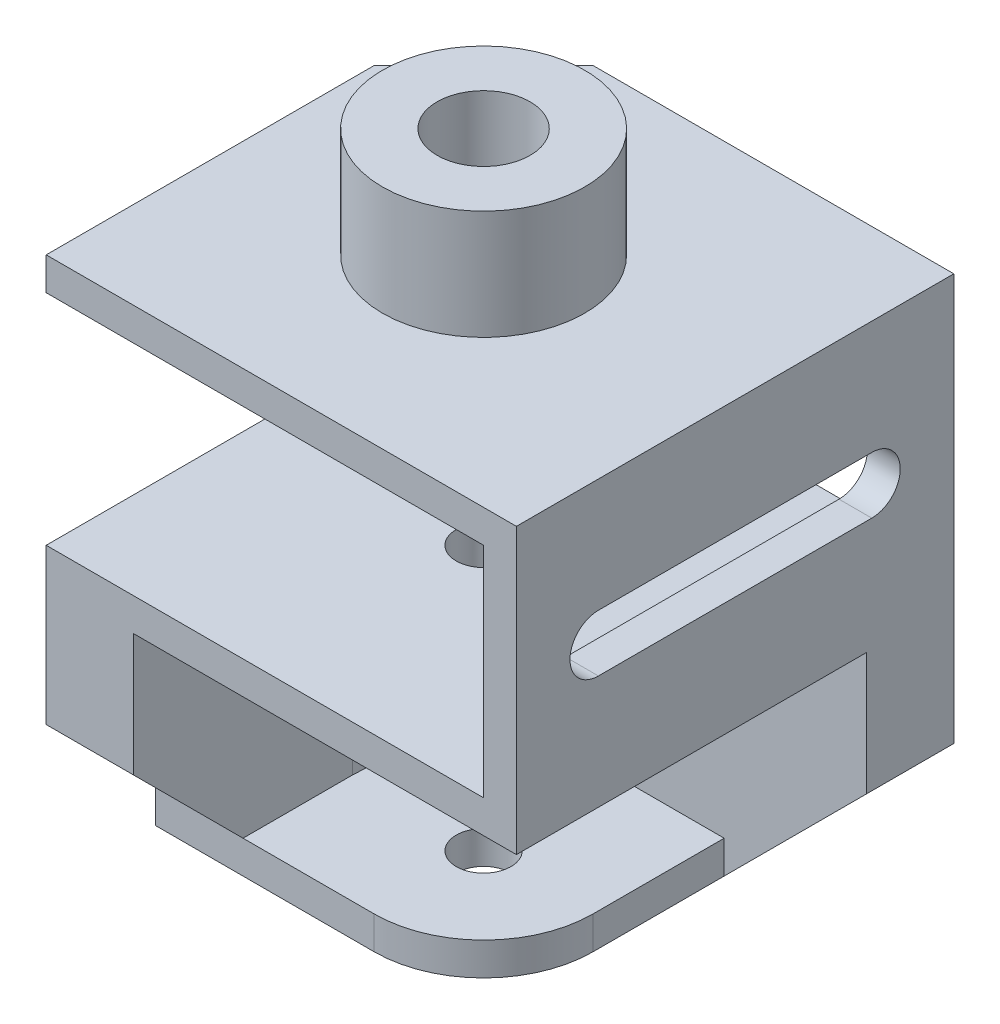
ISO-10303-21;
HEADER;
FILE_DESCRIPTION(('STEP AP214'),'2;1');
FILE_NAME('part.step','',(''),(''),'','','');
FILE_SCHEMA(('AUTOMOTIVE_DESIGN { 1 0 10303 214 1 1 1 1 }'));
ENDSEC;
DATA;
#1=APPLICATION_CONTEXT('core data for automotive mechanical design processes');
#2=APPLICATION_PROTOCOL_DEFINITION('international standard','automotive_design',2000,#1);
#3=PRODUCT_CONTEXT('',#1,'mechanical');
#4=PRODUCT('Part','Part','',(#3));
#5=PRODUCT_RELATED_PRODUCT_CATEGORY('part','',(#4));
#6=PRODUCT_DEFINITION_FORMATION('','',#4);
#7=PRODUCT_DEFINITION_CONTEXT('part definition',#1,'design');
#8=PRODUCT_DEFINITION('design','',#6,#7);
#9=PRODUCT_DEFINITION_SHAPE('','',#8);
#10=(LENGTH_UNIT() NAMED_UNIT(*) SI_UNIT(.MILLI.,.METRE.));
#11=(NAMED_UNIT(*) PLANE_ANGLE_UNIT() SI_UNIT($,.RADIAN.));
#12=(NAMED_UNIT(*) SI_UNIT($,.STERADIAN.) SOLID_ANGLE_UNIT());
#13=UNCERTAINTY_MEASURE_WITH_UNIT(LENGTH_MEASURE(1.E-05),#10,'distance_accuracy_value','');
#14=(GEOMETRIC_REPRESENTATION_CONTEXT(3) GLOBAL_UNCERTAINTY_ASSIGNED_CONTEXT((#13)) GLOBAL_UNIT_ASSIGNED_CONTEXT((#10,
#11,#12)) REPRESENTATION_CONTEXT('',''));
#15=CARTESIAN_POINT('',(0.,0.,0.));
#16=DIRECTION('',(0.,0.,1.));
#17=DIRECTION('',(1.,0.,0.));
#18=AXIS2_PLACEMENT_3D('',#15,#16,#17);
#19=CARTESIAN_POINT('',(9.99999999999994,-47.2,0.));
#20=DIRECTION('',(-1.,0.,0.));
#21=DIRECTION('',(0.,0.,1.));
#22=AXIS2_PLACEMENT_3D('',#19,#20,#21);
#23=PLANE('',#22);
#24=DIRECTION('',(0.,1.,0.));
#25=VECTOR('',#24,1.);
#26=CARTESIAN_POINT('',(9.99999999999994,-44.2,-12.));
#27=LINE('',#26,#25);
#28=CARTESIAN_POINT('',(9.99999999999994,-47.2,-12.));
#29=VERTEX_POINT('',#28);
#30=CARTESIAN_POINT('',(9.99999999999994,-44.2,-12.));
#31=VERTEX_POINT('',#30);
#32=EDGE_CURVE('E206',#29,#31,#27,.T.);
#33=ORIENTED_EDGE('',*,*,#32,.T.);
#34=DIRECTION('',(0.,0.,1.));
#35=VECTOR('',#34,1.);
#36=CARTESIAN_POINT('',(9.99999999999994,-44.2,0.));
#37=LINE('',#36,#35);
#38=CARTESIAN_POINT('',(9.99999999999994,-44.2,0.));
#39=VERTEX_POINT('',#38);
#40=EDGE_CURVE('E520',#31,#39,#37,.T.);
#41=ORIENTED_EDGE('',*,*,#40,.T.);
#42=DIRECTION('',(0.,1.,0.));
#43=VECTOR('',#42,1.);
#44=CARTESIAN_POINT('',(9.99999999999994,-47.2,0.));
#45=LINE('',#44,#43);
#46=CARTESIAN_POINT('',(9.99999999999994,-47.2,0.));
#47=VERTEX_POINT('',#46);
#48=EDGE_CURVE('E527',#47,#39,#45,.T.);
#49=ORIENTED_EDGE('',*,*,#48,.F.);
#50=DIRECTION('',(0.,0.,1.));
#51=VECTOR('',#50,1.);
#52=CARTESIAN_POINT('',(9.99999999999994,-47.2,0.));
#53=LINE('',#52,#51);
#54=EDGE_CURVE('E564',#29,#47,#53,.T.);
#55=ORIENTED_EDGE('',*,*,#54,.F.);
#56=EDGE_LOOP('',(#33,#41,#49,#55));
#57=FACE_BOUND('',#56,.T.);
#58=ADVANCED_FACE('F33',(#57),#23,.F.);
#59=CARTESIAN_POINT('',(0.,-23.,0.));
#60=DIRECTION('',(0.,1.,0.));
#61=DIRECTION('',(0.,0.,1.));
#62=AXIS2_PLACEMENT_3D('',#59,#60,#61);
#63=PLANE('',#62);
#64=CARTESIAN_POINT('',(0.,-23.,0.));
#65=DIRECTION('',(0.,1.,0.));
#66=DIRECTION('',(0.,0.,1.));
#67=AXIS2_PLACEMENT_3D('',#64,#65,#66);
#68=CIRCLE('',#67,6.);
#69=CARTESIAN_POINT('',(0.,-23.,5.99999999999999));
#70=VERTEX_POINT('',#69);
#71=EDGE_CURVE('E232',#70,#70,#68,.F.);
#72=ORIENTED_EDGE('',*,*,#71,.F.);
#73=EDGE_LOOP('',(#72));
#74=FACE_BOUND('',#73,.T.);
#75=DIRECTION('',(0.,0.,1.));
#76=VECTOR('',#75,1.);
#77=CARTESIAN_POINT('',(-12.,-23.,0.));
#78=LINE('',#77,#76);
#79=CARTESIAN_POINT('',(-12.,-23.,0.));
#80=VERTEX_POINT('',#79);
#81=CARTESIAN_POINT('',(-12.,-23.,20.));
#82=VERTEX_POINT('',#81);
#83=EDGE_CURVE('E278',#80,#82,#78,.T.);
#84=ORIENTED_EDGE('',*,*,#83,.F.);
#85=CARTESIAN_POINT('',(0.,-23.,0.));
#86=DIRECTION('',(0.,1.,0.));
#87=DIRECTION('',(0.,0.,1.));
#88=AXIS2_PLACEMENT_3D('',#85,#86,#87);
#89=CIRCLE('',#88,12.);
#90=CARTESIAN_POINT('',(0.,-23.,-12.));
#91=VERTEX_POINT('',#90);
#92=EDGE_CURVE('E539',#91,#80,#89,.T.);
#93=ORIENTED_EDGE('',*,*,#92,.F.);
#94=DIRECTION('',(-1.,0.,0.));
#95=VECTOR('',#94,1.);
#96=CARTESIAN_POINT('',(23.,-23.,-12.));
#97=LINE('',#96,#95);
#98=CARTESIAN_POINT('',(23.,-23.,-12.));
#99=VERTEX_POINT('',#98);
#100=EDGE_CURVE('E530',#99,#91,#97,.T.);
#101=ORIENTED_EDGE('',*,*,#100,.F.);
#102=DIRECTION('',(0.,0.,1.));
#103=VECTOR('',#102,1.);
#104=CARTESIAN_POINT('',(23.,-23.,20.));
#105=LINE('',#104,#103);
#106=CARTESIAN_POINT('',(23.,-23.,20.));
#107=VERTEX_POINT('',#106);
#108=EDGE_CURVE('E304',#99,#107,#105,.T.);
#109=ORIENTED_EDGE('',*,*,#108,.T.);
#110=DIRECTION('',(-1.,0.,0.));
#111=VECTOR('',#110,1.);
#112=CARTESIAN_POINT('',(23.,-23.,20.));
#113=LINE('',#112,#111);
#114=EDGE_CURVE('E268',#107,#82,#113,.T.);
#115=ORIENTED_EDGE('',*,*,#114,.T.);
#116=EDGE_LOOP('',(#84,#93,#101,#109,#115));
#117=FACE_BOUND('',#116,.T.);
#118=ADVANCED_FACE('F368',(#74,#117),#63,.F.);
#119=CARTESIAN_POINT('',(0.,3.,0.));
#120=DIRECTION('',(0.,1.,0.));
#121=DIRECTION('',(0.,0.,1.));
#122=AXIS2_PLACEMENT_3D('',#119,#120,#121);
#123=PLANE('',#122);
#124=DIRECTION('',(0.707106781186548,0.,-0.707106781186547));
#125=VECTOR('',#124,1.);
#126=CARTESIAN_POINT('',(-15.,3.,-15.));
#127=LINE('',#126,#125);
#128=CARTESIAN_POINT('',(-20.,3.,-10.));
#129=VERTEX_POINT('',#128);
#130=CARTESIAN_POINT('',(-9.99999999999999,3.,-20.));
#131=VERTEX_POINT('',#130);
#132=EDGE_CURVE('E187',#129,#131,#127,.T.);
#133=ORIENTED_EDGE('',*,*,#132,.F.);
#134=DIRECTION('',(0.,0.,1.));
#135=VECTOR('',#134,1.);
#136=CARTESIAN_POINT('',(-20.,3.,-20.));
#137=LINE('',#136,#135);
#138=CARTESIAN_POINT('',(-20.,3.,20.));
#139=VERTEX_POINT('',#138);
#140=EDGE_CURVE('E212',#129,#139,#137,.T.);
#141=ORIENTED_EDGE('',*,*,#140,.T.);
#142=DIRECTION('',(1.,0.,0.));
#143=VECTOR('',#142,1.);
#144=CARTESIAN_POINT('',(-20.,3.,20.));
#145=LINE('',#144,#143);
#146=CARTESIAN_POINT('',(23.,3.,20.));
#147=VERTEX_POINT('',#146);
#148=EDGE_CURVE('E215',#139,#147,#145,.T.);
#149=ORIENTED_EDGE('',*,*,#148,.T.);
#150=DIRECTION('',(0.,0.,1.));
#151=VECTOR('',#150,1.);
#152=CARTESIAN_POINT('',(23.,3.,20.));
#153=LINE('',#152,#151);
#154=CARTESIAN_POINT('',(23.,3.,-20.));
#155=VERTEX_POINT('',#154);
#156=EDGE_CURVE('E211',#155,#147,#153,.T.);
#157=ORIENTED_EDGE('',*,*,#156,.F.);
#158=DIRECTION('',(-1.,0.,0.));
#159=VECTOR('',#158,1.);
#160=CARTESIAN_POINT('',(-20.,3.,-20.));
#161=LINE('',#160,#159);
#162=EDGE_CURVE('E202',#155,#131,#161,.T.);
#163=ORIENTED_EDGE('',*,*,#162,.T.);
#164=EDGE_LOOP('',(#133,#141,#149,#157,#163));
#165=FACE_BOUND('',#164,.T.);
#166=CARTESIAN_POINT('',(0.,3.,0.));
#167=DIRECTION('',(0.,1.,0.));
#168=DIRECTION('',(0.,0.,1.));
#169=AXIS2_PLACEMENT_3D('',#166,#167,#168);
#170=CIRCLE('',#169,9.25);
#171=CARTESIAN_POINT('',(0.,3.,9.24999999999999));
#172=VERTEX_POINT('',#171);
#173=EDGE_CURVE('E359',#172,#172,#170,.T.);
#174=ORIENTED_EDGE('',*,*,#173,.F.);
#175=EDGE_LOOP('',(#174));
#176=FACE_BOUND('',#175,.T.);
#177=ADVANCED_FACE('F208',(#165,#176),#123,.T.);
#178=CARTESIAN_POINT('',(0.,0.,0.));
#179=DIRECTION('',(0.,1.,0.));
#180=DIRECTION('',(0.,0.,1.));
#181=AXIS2_PLACEMENT_3D('',#178,#179,#180);
#182=PLANE('',#181);
#183=DIRECTION('',(0.,0.,1.));
#184=VECTOR('',#183,1.);
#185=CARTESIAN_POINT('',(-20.,0.,-20.));
#186=LINE('',#185,#184);
#187=CARTESIAN_POINT('',(-20.,0.,-10.));
#188=VERTEX_POINT('',#187);
#189=CARTESIAN_POINT('',(-20.,0.,20.));
#190=VERTEX_POINT('',#189);
#191=EDGE_CURVE('E217',#188,#190,#186,.T.);
#192=ORIENTED_EDGE('',*,*,#191,.F.);
#193=DIRECTION('',(0.707106781186548,0.,-0.707106781186547));
#194=VECTOR('',#193,1.);
#195=CARTESIAN_POINT('',(-15.,0.,-15.));
#196=LINE('',#195,#194);
#197=CARTESIAN_POINT('',(-9.99999999999999,0.,-20.));
#198=VERTEX_POINT('',#197);
#199=EDGE_CURVE('E56',#188,#198,#196,.T.);
#200=ORIENTED_EDGE('',*,*,#199,.T.);
#201=DIRECTION('',(-1.,0.,0.));
#202=VECTOR('',#201,1.);
#203=CARTESIAN_POINT('',(-20.,0.,-20.));
#204=LINE('',#203,#202);
#205=CARTESIAN_POINT('',(20.,0.,-20.));
#206=VERTEX_POINT('',#205);
#207=EDGE_CURVE('E205',#206,#198,#204,.T.);
#208=ORIENTED_EDGE('',*,*,#207,.F.);
#209=DIRECTION('',(0.,0.,-1.));
#210=VECTOR('',#209,1.);
#211=CARTESIAN_POINT('',(20.,0.,-20.));
#212=LINE('',#211,#210);
#213=CARTESIAN_POINT('',(20.,0.,20.));
#214=VERTEX_POINT('',#213);
#215=EDGE_CURVE('E225',#214,#206,#212,.T.);
#216=ORIENTED_EDGE('',*,*,#215,.F.);
#217=DIRECTION('',(1.,0.,0.));
#218=VECTOR('',#217,1.);
#219=CARTESIAN_POINT('',(-20.,0.,20.));
#220=LINE('',#219,#218);
#221=EDGE_CURVE('E213',#190,#214,#220,.T.);
#222=ORIENTED_EDGE('',*,*,#221,.F.);
#223=EDGE_LOOP('',(#192,#200,#208,#216,#222));
#224=FACE_BOUND('',#223,.T.);
#225=CARTESIAN_POINT('',(0.,0.,0.));
#226=DIRECTION('',(0.,1.,0.));
#227=DIRECTION('',(0.,0.,1.));
#228=AXIS2_PLACEMENT_3D('',#225,#226,#227);
#229=CIRCLE('',#228,4.25);
#230=CARTESIAN_POINT('',(0.,0.,4.24999999999999));
#231=VERTEX_POINT('',#230);
#232=EDGE_CURVE('E220',#231,#231,#229,.T.);
#233=ORIENTED_EDGE('',*,*,#232,.T.);
#234=EDGE_LOOP('',(#233));
#235=FACE_BOUND('',#234,.T.);
#236=ADVANCED_FACE('F367',(#224,#235),#182,.F.);
#237=CARTESIAN_POINT('',(-20.,3.,-20.));
#238=DIRECTION('',(0.,0.,1.));
#239=DIRECTION('',(1.,0.,0.));
#240=AXIS2_PLACEMENT_3D('',#237,#238,#239);
#241=PLANE('',#240);
#242=DIRECTION('',(0.,1.,0.));
#243=VECTOR('',#242,1.);
#244=CARTESIAN_POINT('',(-10.,-102.928187440104,-20.));
#245=LINE('',#244,#243);
#246=CARTESIAN_POINT('',(-10.,-47.2,-20.));
#247=VERTEX_POINT('',#246);
#248=CARTESIAN_POINT('',(-9.99999999999999,-20.,-20.));
#249=VERTEX_POINT('',#248);
#250=EDGE_CURVE('E286',#247,#249,#245,.T.);
#251=ORIENTED_EDGE('',*,*,#250,.T.);
#252=DIRECTION('',(1.,0.,0.));
#253=VECTOR('',#252,1.);
#254=CARTESIAN_POINT('',(23.,-20.,-20.));
#255=LINE('',#254,#253);
#256=CARTESIAN_POINT('',(20.,-20.,-20.));
#257=VERTEX_POINT('',#256);
#258=EDGE_CURVE('E306',#249,#257,#255,.T.);
#259=ORIENTED_EDGE('',*,*,#258,.T.);
#260=DIRECTION('',(0.,1.,0.));
#261=VECTOR('',#260,1.);
#262=CARTESIAN_POINT('',(20.,3.,-20.));
#263=LINE('',#262,#261);
#264=EDGE_CURVE('E348',#257,#206,#263,.T.);
#265=ORIENTED_EDGE('',*,*,#264,.T.);
#266=ORIENTED_EDGE('',*,*,#207,.T.);
#267=DIRECTION('',(0.,-1.,0.));
#268=VECTOR('',#267,1.);
#269=CARTESIAN_POINT('',(-9.99999999999999,8.,-20.));
#270=LINE('',#269,#268);
#271=EDGE_CURVE('E190',#131,#198,#270,.T.);
#272=ORIENTED_EDGE('',*,*,#271,.F.);
#273=ORIENTED_EDGE('',*,*,#162,.F.);
#274=DIRECTION('',(0.,1.,0.));
#275=VECTOR('',#274,1.);
#276=CARTESIAN_POINT('',(23.,3.,-20.));
#277=LINE('',#276,#275);
#278=CARTESIAN_POINT('',(23.,-34.2,-20.));
#279=VERTEX_POINT('',#278);
#280=EDGE_CURVE('E347',#279,#155,#277,.T.);
#281=ORIENTED_EDGE('',*,*,#280,.F.);
#282=DIRECTION('',(-0.707106781186549,-0.707106781186546,0.));
#283=VECTOR('',#282,1.);
#284=CARTESIAN_POINT('',(23.,-34.2,-20.));
#285=LINE('',#284,#283);
#286=CARTESIAN_POINT('',(9.99999999999994,-47.2,-20.));
#287=VERTEX_POINT('',#286);
#288=EDGE_CURVE('E238',#279,#287,#285,.T.);
#289=ORIENTED_EDGE('',*,*,#288,.T.);
#290=DIRECTION('',(1.,0.,0.));
#291=VECTOR('',#290,1.);
#292=CARTESIAN_POINT('',(-10.,-47.2,-20.));
#293=LINE('',#292,#291);
#294=EDGE_CURVE('E518',#247,#287,#293,.T.);
#295=ORIENTED_EDGE('',*,*,#294,.F.);
#296=EDGE_LOOP('',(#251,#259,#265,#266,#272,#273,#281,#289,#295));
#297=FACE_BOUND('',#296,.T.);
#298=ADVANCED_FACE('F200',(#297),#241,.F.);
#299=CARTESIAN_POINT('',(-20.,3.,-20.));
#300=DIRECTION('',(1.,0.,0.));
#301=DIRECTION('',(0.,0.,-1.));
#302=AXIS2_PLACEMENT_3D('',#299,#300,#301);
#303=PLANE('',#302);
#304=ORIENTED_EDGE('',*,*,#140,.F.);
#305=DIRECTION('',(0.,-1.,0.));
#306=VECTOR('',#305,1.);
#307=CARTESIAN_POINT('',(-20.,8.,-10.));
#308=LINE('',#307,#306);
#309=EDGE_CURVE('E191',#129,#188,#308,.T.);
#310=ORIENTED_EDGE('',*,*,#309,.T.);
#311=ORIENTED_EDGE('',*,*,#191,.T.);
#312=DIRECTION('',(0.,-1.,0.));
#313=VECTOR('',#312,1.);
#314=CARTESIAN_POINT('',(-20.,3.,20.));
#315=LINE('',#314,#313);
#316=EDGE_CURVE('E224',#139,#190,#315,.T.);
#317=ORIENTED_EDGE('',*,*,#316,.F.);
#318=EDGE_LOOP('',(#304,#310,#311,#317));
#319=FACE_BOUND('',#318,.T.);
#320=ADVANCED_FACE('F461',(#319),#303,.F.);
#321=CARTESIAN_POINT('',(-20.,3.,20.));
#322=DIRECTION('',(0.,0.,-1.));
#323=DIRECTION('',(-1.,0.,0.));
#324=AXIS2_PLACEMENT_3D('',#321,#322,#323);
#325=PLANE('',#324);
#326=DIRECTION('',(0.,1.,0.));
#327=VECTOR('',#326,1.);
#328=CARTESIAN_POINT('',(-20.,-23.,20.));
#329=LINE('',#328,#327);
#330=CARTESIAN_POINT('',(-20.,-34.2,20.));
#331=VERTEX_POINT('',#330);
#332=CARTESIAN_POINT('',(-20.,-20.,20.));
#333=VERTEX_POINT('',#332);
#334=EDGE_CURVE('E253',#331,#333,#329,.T.);
#335=ORIENTED_EDGE('',*,*,#334,.F.);
#336=DIRECTION('',(1.,0.,0.));
#337=VECTOR('',#336,1.);
#338=CARTESIAN_POINT('',(-20.,-34.2,20.));
#339=LINE('',#338,#337);
#340=CARTESIAN_POINT('',(-12.,-34.2,20.));
#341=VERTEX_POINT('',#340);
#342=EDGE_CURVE('E244',#331,#341,#339,.T.);
#343=ORIENTED_EDGE('',*,*,#342,.T.);
#344=DIRECTION('',(0.,1.,0.));
#345=VECTOR('',#344,1.);
#346=CARTESIAN_POINT('',(-12.,-102.928187440104,20.));
#347=LINE('',#346,#345);
#348=EDGE_CURVE('E277',#341,#82,#347,.T.);
#349=ORIENTED_EDGE('',*,*,#348,.T.);
#350=ORIENTED_EDGE('',*,*,#114,.F.);
#351=DIRECTION('',(0.,-1.,0.));
#352=VECTOR('',#351,1.);
#353=CARTESIAN_POINT('',(23.,3.,20.));
#354=LINE('',#353,#352);
#355=EDGE_CURVE('E344',#147,#107,#354,.T.);
#356=ORIENTED_EDGE('',*,*,#355,.F.);
#357=ORIENTED_EDGE('',*,*,#148,.F.);
#358=ORIENTED_EDGE('',*,*,#316,.T.);
#359=ORIENTED_EDGE('',*,*,#221,.T.);
#360=DIRECTION('',(0.,-1.,0.));
#361=VECTOR('',#360,1.);
#362=CARTESIAN_POINT('',(20.,3.,20.));
#363=LINE('',#362,#361);
#364=CARTESIAN_POINT('',(20.,-20.,20.));
#365=VERTEX_POINT('',#364);
#366=EDGE_CURVE('E337',#214,#365,#363,.T.);
#367=ORIENTED_EDGE('',*,*,#366,.T.);
#368=DIRECTION('',(-1.,0.,0.));
#369=VECTOR('',#368,1.);
#370=CARTESIAN_POINT('',(23.,-20.,20.));
#371=LINE('',#370,#369);
#372=EDGE_CURVE('E265',#365,#333,#371,.T.);
#373=ORIENTED_EDGE('',*,*,#372,.T.);
#374=EDGE_LOOP('',(#335,#343,#349,#350,#356,#357,#358,#359,#367,#373));
#375=FACE_BOUND('',#374,.T.);
#376=ADVANCED_FACE('F262',(#375),#325,.F.);
#377=CARTESIAN_POINT('',(0.,3.,0.));
#378=DIRECTION('',(0.,-1.,0.));
#379=DIRECTION('',(0.,0.,-1.));
#380=AXIS2_PLACEMENT_3D('',#377,#378,#379);
#381=CYLINDRICAL_SURFACE('',#380,4.25);
#382=ORIENTED_EDGE('',*,*,#232,.F.);
#383=EDGE_LOOP('',(#382));
#384=FACE_BOUND('',#383,.T.);
#385=CARTESIAN_POINT('',(0.,13.,0.));
#386=DIRECTION('',(0.,1.,0.));
#387=DIRECTION('',(0.,0.,1.));
#388=AXIS2_PLACEMENT_3D('',#385,#386,#387);
#389=CIRCLE('',#388,4.25);
#390=CARTESIAN_POINT('',(0.,13.,4.24999999999999));
#391=VERTEX_POINT('',#390);
#392=EDGE_CURVE('E351',#391,#391,#389,.T.);
#393=ORIENTED_EDGE('',*,*,#392,.T.);
#394=EDGE_LOOP('',(#393));
#395=FACE_BOUND('',#394,.T.);
#396=ADVANCED_FACE('F451',(#384,#395),#381,.F.);
#397=CARTESIAN_POINT('',(0.,13.,0.));
#398=DIRECTION('',(0.,1.,0.));
#399=DIRECTION('',(0.,0.,1.));
#400=AXIS2_PLACEMENT_3D('',#397,#398,#399);
#401=PLANE('',#400);
#402=CARTESIAN_POINT('',(0.,13.,0.));
#403=DIRECTION('',(0.,1.,0.));
#404=DIRECTION('',(0.,0.,1.));
#405=AXIS2_PLACEMENT_3D('',#402,#403,#404);
#406=CIRCLE('',#405,9.25);
#407=CARTESIAN_POINT('',(0.,13.,9.24999999999999));
#408=VERTEX_POINT('',#407);
#409=EDGE_CURVE('E360',#408,#408,#406,.T.);
#410=ORIENTED_EDGE('',*,*,#409,.T.);
#411=EDGE_LOOP('',(#410));
#412=FACE_BOUND('',#411,.T.);
#413=ORIENTED_EDGE('',*,*,#392,.F.);
#414=EDGE_LOOP('',(#413));
#415=FACE_BOUND('',#414,.T.);
#416=ADVANCED_FACE('F448',(#412,#415),#401,.T.);
#417=CARTESIAN_POINT('',(0.,13.,0.));
#418=DIRECTION('',(0.,-1.,0.));
#419=DIRECTION('',(0.,0.,-1.));
#420=AXIS2_PLACEMENT_3D('',#417,#418,#419);
#421=CYLINDRICAL_SURFACE('',#420,9.25);
#422=ORIENTED_EDGE('',*,*,#409,.F.);
#423=EDGE_LOOP('',(#422));
#424=FACE_BOUND('',#423,.T.);
#425=ORIENTED_EDGE('',*,*,#173,.T.);
#426=EDGE_LOOP('',(#425));
#427=FACE_BOUND('',#426,.T.);
#428=ADVANCED_FACE('F365',(#424,#427),#421,.T.);
#429=CARTESIAN_POINT('',(20.,0.,0.));
#430=DIRECTION('',(1.,0.,0.));
#431=DIRECTION('',(0.,0.,-1.));
#432=AXIS2_PLACEMENT_3D('',#429,#430,#431);
#433=PLANE('',#432);
#434=DIRECTION('',(0.,0.,1.));
#435=VECTOR('',#434,1.);
#436=CARTESIAN_POINT('',(20.,-12.6,-12.5));
#437=LINE('',#436,#435);
#438=CARTESIAN_POINT('',(20.,-12.6,-12.5));
#439=VERTEX_POINT('',#438);
#440=CARTESIAN_POINT('',(20.,-12.6,12.5));
#441=VERTEX_POINT('',#440);
#442=EDGE_CURVE('E327',#439,#441,#437,.T.);
#443=ORIENTED_EDGE('',*,*,#442,.F.);
#444=CARTESIAN_POINT('',(20.,-10.,-12.5));
#445=DIRECTION('',(-1.,0.,0.));
#446=DIRECTION('',(0.,0.,1.));
#447=AXIS2_PLACEMENT_3D('',#444,#445,#446);
#448=CIRCLE('',#447,2.6);
#449=CARTESIAN_POINT('',(20.,-7.4,-12.5));
#450=VERTEX_POINT('',#449);
#451=EDGE_CURVE('E267',#450,#439,#448,.T.);
#452=ORIENTED_EDGE('',*,*,#451,.F.);
#453=DIRECTION('',(0.,0.,-1.));
#454=VECTOR('',#453,1.);
#455=CARTESIAN_POINT('',(20.,-7.4,-12.5));
#456=LINE('',#455,#454);
#457=CARTESIAN_POINT('',(20.,-7.39999999999999,12.5));
#458=VERTEX_POINT('',#457);
#459=EDGE_CURVE('E316',#458,#450,#456,.T.);
#460=ORIENTED_EDGE('',*,*,#459,.F.);
#461=CARTESIAN_POINT('',(20.,-9.99999999999999,12.5));
#462=DIRECTION('',(-1.,0.,0.));
#463=DIRECTION('',(0.,0.,1.));
#464=AXIS2_PLACEMENT_3D('',#461,#462,#463);
#465=CIRCLE('',#464,2.6);
#466=EDGE_CURVE('E330',#441,#458,#465,.T.);
#467=ORIENTED_EDGE('',*,*,#466,.F.);
#468=EDGE_LOOP('',(#443,#452,#460,#467));
#469=FACE_BOUND('',#468,.T.);
#470=ORIENTED_EDGE('',*,*,#366,.F.);
#471=ORIENTED_EDGE('',*,*,#215,.T.);
#472=ORIENTED_EDGE('',*,*,#264,.F.);
#473=DIRECTION('',(0.,0.,-1.));
#474=VECTOR('',#473,1.);
#475=CARTESIAN_POINT('',(20.,-20.,20.));
#476=LINE('',#475,#474);
#477=EDGE_CURVE('E353',#365,#257,#476,.T.);
#478=ORIENTED_EDGE('',*,*,#477,.F.);
#479=EDGE_LOOP('',(#470,#471,#472,#478));
#480=FACE_BOUND('',#479,.T.);
#481=ADVANCED_FACE('F443',(#469,#480),#433,.F.);
#482=CARTESIAN_POINT('',(23.,0.,0.));
#483=DIRECTION('',(1.,0.,0.));
#484=DIRECTION('',(0.,0.,-1.));
#485=AXIS2_PLACEMENT_3D('',#482,#483,#484);
#486=PLANE('',#485);
#487=CARTESIAN_POINT('',(23.,-10.,-12.5));
#488=DIRECTION('',(-1.,0.,0.));
#489=DIRECTION('',(0.,0.,1.));
#490=AXIS2_PLACEMENT_3D('',#487,#488,#489);
#491=CIRCLE('',#490,2.6);
#492=CARTESIAN_POINT('',(23.,-7.4,-12.5));
#493=VERTEX_POINT('',#492);
#494=CARTESIAN_POINT('',(23.,-12.6,-12.5));
#495=VERTEX_POINT('',#494);
#496=EDGE_CURVE('E312',#493,#495,#491,.T.);
#497=ORIENTED_EDGE('',*,*,#496,.T.);
#498=DIRECTION('',(0.,0.,1.));
#499=VECTOR('',#498,1.);
#500=CARTESIAN_POINT('',(23.,-12.6,-12.5));
#501=LINE('',#500,#499);
#502=CARTESIAN_POINT('',(23.,-12.6,12.5));
#503=VERTEX_POINT('',#502);
#504=EDGE_CURVE('E315',#495,#503,#501,.T.);
#505=ORIENTED_EDGE('',*,*,#504,.T.);
#506=CARTESIAN_POINT('',(23.,-9.99999999999999,12.5));
#507=DIRECTION('',(-1.,0.,0.));
#508=DIRECTION('',(0.,0.,1.));
#509=AXIS2_PLACEMENT_3D('',#506,#507,#508);
#510=CIRCLE('',#509,2.6);
#511=CARTESIAN_POINT('',(23.,-7.39999999999999,12.5));
#512=VERTEX_POINT('',#511);
#513=EDGE_CURVE('E319',#503,#512,#510,.T.);
#514=ORIENTED_EDGE('',*,*,#513,.T.);
#515=DIRECTION('',(0.,0.,-1.));
#516=VECTOR('',#515,1.);
#517=CARTESIAN_POINT('',(23.,-7.4,-12.5));
#518=LINE('',#517,#516);
#519=EDGE_CURVE('E322',#512,#493,#518,.T.);
#520=ORIENTED_EDGE('',*,*,#519,.T.);
#521=EDGE_LOOP('',(#497,#505,#514,#520));
#522=FACE_BOUND('',#521,.T.);
#523=DIRECTION('',(0.,1.,0.));
#524=VECTOR('',#523,1.);
#525=CARTESIAN_POINT('',(23.,-102.928187440104,-12.));
#526=LINE('',#525,#524);
#527=CARTESIAN_POINT('',(23.,-34.2,-12.));
#528=VERTEX_POINT('',#527);
#529=EDGE_CURVE('E292',#528,#99,#526,.T.);
#530=ORIENTED_EDGE('',*,*,#529,.F.);
#531=DIRECTION('',(0.,0.,-1.));
#532=VECTOR('',#531,1.);
#533=CARTESIAN_POINT('',(23.,-34.2,-20.));
#534=LINE('',#533,#532);
#535=EDGE_CURVE('E235',#528,#279,#534,.T.);
#536=ORIENTED_EDGE('',*,*,#535,.T.);
#537=ORIENTED_EDGE('',*,*,#280,.T.);
#538=ORIENTED_EDGE('',*,*,#156,.T.);
#539=ORIENTED_EDGE('',*,*,#355,.T.);
#540=ORIENTED_EDGE('',*,*,#108,.F.);
#541=EDGE_LOOP('',(#530,#536,#537,#538,#539,#540));
#542=FACE_BOUND('',#541,.T.);
#543=ADVANCED_FACE('F439',(#522,#542),#486,.T.);
#544=CARTESIAN_POINT('',(23.,-10.,-12.5));
#545=DIRECTION('',(-1.,0.,0.));
#546=DIRECTION('',(0.,0.,1.));
#547=AXIS2_PLACEMENT_3D('',#544,#545,#546);
#548=CYLINDRICAL_SURFACE('',#547,2.6);
#549=ORIENTED_EDGE('',*,*,#451,.T.);
#550=DIRECTION('',(-1.,0.,0.));
#551=VECTOR('',#550,1.);
#552=CARTESIAN_POINT('',(23.,-12.6,-12.5));
#553=LINE('',#552,#551);
#554=EDGE_CURVE('E325',#495,#439,#553,.T.);
#555=ORIENTED_EDGE('',*,*,#554,.F.);
#556=ORIENTED_EDGE('',*,*,#496,.F.);
#557=DIRECTION('',(-1.,0.,0.));
#558=VECTOR('',#557,1.);
#559=CARTESIAN_POINT('',(23.,-7.4,-12.5));
#560=LINE('',#559,#558);
#561=EDGE_CURVE('E335',#493,#450,#560,.T.);
#562=ORIENTED_EDGE('',*,*,#561,.T.);
#563=EDGE_LOOP('',(#549,#555,#556,#562));
#564=FACE_BOUND('',#563,.T.);
#565=ADVANCED_FACE('F429',(#564),#548,.F.);
#566=CARTESIAN_POINT('',(23.,-7.4,-12.5));
#567=DIRECTION('',(0.,1.,0.));
#568=DIRECTION('',(0.,0.,1.));
#569=AXIS2_PLACEMENT_3D('',#566,#567,#568);
#570=PLANE('',#569);
#571=ORIENTED_EDGE('',*,*,#459,.T.);
#572=ORIENTED_EDGE('',*,*,#561,.F.);
#573=ORIENTED_EDGE('',*,*,#519,.F.);
#574=DIRECTION('',(-1.,0.,0.));
#575=VECTOR('',#574,1.);
#576=CARTESIAN_POINT('',(23.,-7.39999999999999,12.5));
#577=LINE('',#576,#575);
#578=EDGE_CURVE('E338',#512,#458,#577,.T.);
#579=ORIENTED_EDGE('',*,*,#578,.T.);
#580=EDGE_LOOP('',(#571,#572,#573,#579));
#581=FACE_BOUND('',#580,.T.);
#582=ADVANCED_FACE('F425',(#581),#570,.F.);
#583=CARTESIAN_POINT('',(23.,-9.99999999999999,12.5));
#584=DIRECTION('',(-1.,0.,0.));
#585=DIRECTION('',(0.,0.,1.));
#586=AXIS2_PLACEMENT_3D('',#583,#584,#585);
#587=CYLINDRICAL_SURFACE('',#586,2.6);
#588=ORIENTED_EDGE('',*,*,#466,.T.);
#589=ORIENTED_EDGE('',*,*,#578,.F.);
#590=ORIENTED_EDGE('',*,*,#513,.F.);
#591=DIRECTION('',(-1.,0.,0.));
#592=VECTOR('',#591,1.);
#593=CARTESIAN_POINT('',(23.,-12.6,12.5));
#594=LINE('',#593,#592);
#595=EDGE_CURVE('E340',#503,#441,#594,.T.);
#596=ORIENTED_EDGE('',*,*,#595,.T.);
#597=EDGE_LOOP('',(#588,#589,#590,#596));
#598=FACE_BOUND('',#597,.T.);
#599=ADVANCED_FACE('F428',(#598),#587,.F.);
#600=CARTESIAN_POINT('',(23.,-12.6,-12.5));
#601=DIRECTION('',(0.,-1.,0.));
#602=DIRECTION('',(0.,0.,-1.));
#603=AXIS2_PLACEMENT_3D('',#600,#601,#602);
#604=PLANE('',#603);
#605=ORIENTED_EDGE('',*,*,#442,.T.);
#606=ORIENTED_EDGE('',*,*,#595,.F.);
#607=ORIENTED_EDGE('',*,*,#504,.F.);
#608=ORIENTED_EDGE('',*,*,#554,.T.);
#609=EDGE_LOOP('',(#605,#606,#607,#608));
#610=FACE_BOUND('',#609,.T.);
#611=ADVANCED_FACE('F424',(#610),#604,.F.);
#612=CARTESIAN_POINT('',(-20.,-23.,20.));
#613=DIRECTION('',(1.,0.,0.));
#614=DIRECTION('',(0.,0.,-1.));
#615=AXIS2_PLACEMENT_3D('',#612,#613,#614);
#616=PLANE('',#615);
#617=DIRECTION('',(0.,0.,-1.));
#618=VECTOR('',#617,1.);
#619=CARTESIAN_POINT('',(-20.,-20.,20.));
#620=LINE('',#619,#618);
#621=CARTESIAN_POINT('',(-20.,-20.,-10.));
#622=VERTEX_POINT('',#621);
#623=EDGE_CURVE('E309',#333,#622,#620,.T.);
#624=ORIENTED_EDGE('',*,*,#623,.T.);
#625=DIRECTION('',(0.,1.,0.));
#626=VECTOR('',#625,1.);
#627=CARTESIAN_POINT('',(-20.,-102.928187440104,-10.));
#628=LINE('',#627,#626);
#629=CARTESIAN_POINT('',(-20.,-47.2,-10.));
#630=VERTEX_POINT('',#629);
#631=EDGE_CURVE('E282',#630,#622,#628,.T.);
#632=ORIENTED_EDGE('',*,*,#631,.F.);
#633=DIRECTION('',(0.,0.,-1.));
#634=VECTOR('',#633,1.);
#635=CARTESIAN_POINT('',(-20.,-47.2,9.99999999999994));
#636=LINE('',#635,#634);
#637=CARTESIAN_POINT('',(-20.,-47.2,9.99999999999994));
#638=VERTEX_POINT('',#637);
#639=EDGE_CURVE('E525',#638,#630,#636,.T.);
#640=ORIENTED_EDGE('',*,*,#639,.F.);
#641=DIRECTION('',(0.,1.,0.));
#642=VECTOR('',#641,1.);
#643=CARTESIAN_POINT('',(-20.,-47.2,9.99999999999994));
#644=LINE('',#643,#642);
#645=CARTESIAN_POINT('',(-20.,-44.2,9.99999999999994));
#646=VERTEX_POINT('',#645);
#647=EDGE_CURVE('E257',#638,#646,#644,.T.);
#648=ORIENTED_EDGE('',*,*,#647,.T.);
#649=DIRECTION('',(0.,-0.707106781186546,-0.707106781186549));
#650=VECTOR('',#649,1.);
#651=CARTESIAN_POINT('',(-20.,-34.2,20.));
#652=LINE('',#651,#650);
#653=EDGE_CURVE('E41',#646,#331,#652,.F.);
#654=ORIENTED_EDGE('',*,*,#653,.T.);
#655=ORIENTED_EDGE('',*,*,#334,.T.);
#656=EDGE_LOOP('',(#624,#632,#640,#648,#654,#655));
#657=FACE_BOUND('',#656,.T.);
#658=ADVANCED_FACE('F252',(#657),#616,.F.);
#659=CARTESIAN_POINT('',(0.,-20.,0.));
#660=DIRECTION('',(0.,1.,0.));
#661=DIRECTION('',(0.,0.,1.));
#662=AXIS2_PLACEMENT_3D('',#659,#660,#661);
#663=PLANE('',#662);
#664=DIRECTION('',(0.707106781186548,0.,-0.707106781186547));
#665=VECTOR('',#664,1.);
#666=CARTESIAN_POINT('',(-15.,-20.,-15.));
#667=LINE('',#666,#665);
#668=EDGE_CURVE('E11',#622,#249,#667,.T.);
#669=ORIENTED_EDGE('',*,*,#668,.F.);
#670=ORIENTED_EDGE('',*,*,#623,.F.);
#671=ORIENTED_EDGE('',*,*,#372,.F.);
#672=ORIENTED_EDGE('',*,*,#477,.T.);
#673=ORIENTED_EDGE('',*,*,#258,.F.);
#674=EDGE_LOOP('',(#669,#670,#671,#672,#673));
#675=FACE_BOUND('',#674,.T.);
#676=CARTESIAN_POINT('',(0.,-20.,0.));
#677=DIRECTION('',(0.,1.,0.));
#678=DIRECTION('',(0.,0.,1.));
#679=AXIS2_PLACEMENT_3D('',#676,#677,#678);
#680=CIRCLE('',#679,2.5);
#681=CARTESIAN_POINT('',(0.,-20.,2.49999999999999));
#682=VERTEX_POINT('',#681);
#683=EDGE_CURVE('E301',#682,#682,#680,.T.);
#684=ORIENTED_EDGE('',*,*,#683,.F.);
#685=EDGE_LOOP('',(#684));
#686=FACE_BOUND('',#685,.T.);
#687=ADVANCED_FACE('F416',(#675,#686),#663,.T.);
#688=CARTESIAN_POINT('',(0.,-30.,0.));
#689=DIRECTION('',(0.,1.,0.));
#690=DIRECTION('',(0.,0.,1.));
#691=AXIS2_PLACEMENT_3D('',#688,#689,#690);
#692=CYLINDRICAL_SURFACE('',#691,2.5);
#693=ORIENTED_EDGE('',*,*,#683,.T.);
#694=EDGE_LOOP('',(#693));
#695=FACE_BOUND('',#694,.T.);
#696=CARTESIAN_POINT('',(0.,-24.,0.));
#697=DIRECTION('',(0.,-1.,0.));
#698=DIRECTION('',(0.,0.,-1.));
#699=AXIS2_PLACEMENT_3D('',#696,#697,#698);
#700=CIRCLE('',#699,2.5);
#701=CARTESIAN_POINT('',(0.,-24.,-2.50000000000001));
#702=VERTEX_POINT('',#701);
#703=EDGE_CURVE('E294',#702,#702,#700,.T.);
#704=ORIENTED_EDGE('',*,*,#703,.T.);
#705=EDGE_LOOP('',(#704));
#706=FACE_BOUND('',#705,.T.);
#707=ADVANCED_FACE('F410',(#695,#706),#692,.F.);
#708=CARTESIAN_POINT('',(0.,-24.,0.));
#709=DIRECTION('',(0.,-1.,0.));
#710=DIRECTION('',(0.,0.,-1.));
#711=AXIS2_PLACEMENT_3D('',#708,#709,#710);
#712=PLANE('',#711);
#713=CARTESIAN_POINT('',(0.,-24.,0.));
#714=DIRECTION('',(0.,-1.,0.));
#715=DIRECTION('',(0.,0.,-1.));
#716=AXIS2_PLACEMENT_3D('',#713,#714,#715);
#717=CIRCLE('',#716,6.);
#718=CARTESIAN_POINT('',(0.,-24.,-6.00000000000002));
#719=VERTEX_POINT('',#718);
#720=EDGE_CURVE('E297',#719,#719,#717,.T.);
#721=ORIENTED_EDGE('',*,*,#720,.T.);
#722=EDGE_LOOP('',(#721));
#723=FACE_BOUND('',#722,.T.);
#724=ORIENTED_EDGE('',*,*,#703,.F.);
#725=EDGE_LOOP('',(#724));
#726=FACE_BOUND('',#725,.T.);
#727=ADVANCED_FACE('F407',(#723,#726),#712,.T.);
#728=CARTESIAN_POINT('',(0.,-24.,0.));
#729=DIRECTION('',(0.,1.,0.));
#730=DIRECTION('',(0.,0.,1.));
#731=AXIS2_PLACEMENT_3D('',#728,#729,#730);
#732=CYLINDRICAL_SURFACE('',#731,6.);
#733=ORIENTED_EDGE('',*,*,#720,.F.);
#734=EDGE_LOOP('',(#733));
#735=FACE_BOUND('',#734,.T.);
#736=ORIENTED_EDGE('',*,*,#71,.T.);
#737=EDGE_LOOP('',(#736));
#738=FACE_BOUND('',#737,.T.);
#739=ADVANCED_FACE('F394',(#735,#738),#732,.T.);
#740=CARTESIAN_POINT('',(-20.,-102.928187440104,-10.));
#741=DIRECTION('',(0.707106781186548,0.,0.707106781186548));
#742=DIRECTION('',(0.707106781186548,0.,-0.707106781186548));
#743=AXIS2_PLACEMENT_3D('',#740,#741,#742);
#744=PLANE('',#743);
#745=ORIENTED_EDGE('',*,*,#250,.F.);
#746=DIRECTION('',(0.707106781186548,0.,-0.707106781186548));
#747=VECTOR('',#746,1.);
#748=CARTESIAN_POINT('',(-20.,-47.2,-10.));
#749=LINE('',#748,#747);
#750=EDGE_CURVE('E515',#630,#247,#749,.T.);
#751=ORIENTED_EDGE('',*,*,#750,.F.);
#752=ORIENTED_EDGE('',*,*,#631,.T.);
#753=ORIENTED_EDGE('',*,*,#668,.T.);
#754=EDGE_LOOP('',(#745,#751,#752,#753));
#755=FACE_BOUND('',#754,.T.);
#756=ADVANCED_FACE('F391',(#755),#744,.F.);
#757=CARTESIAN_POINT('',(-12.,-102.928187440104,0.));
#758=DIRECTION('',(-1.,0.,0.));
#759=DIRECTION('',(0.,0.,1.));
#760=AXIS2_PLACEMENT_3D('',#757,#758,#759);
#761=PLANE('',#760);
#762=ORIENTED_EDGE('',*,*,#348,.F.);
#763=DIRECTION('',(0.,0.707106781186546,0.707106781186549));
#764=VECTOR('',#763,1.);
#765=CARTESIAN_POINT('',(-12.,-34.2,20.));
#766=LINE('',#765,#764);
#767=CARTESIAN_POINT('',(-12.,-44.2,9.99999999999994));
#768=VERTEX_POINT('',#767);
#769=EDGE_CURVE('E247',#341,#768,#766,.F.);
#770=ORIENTED_EDGE('',*,*,#769,.T.);
#771=DIRECTION('',(0.,0.,-1.));
#772=VECTOR('',#771,1.);
#773=CARTESIAN_POINT('',(-12.,-44.2,0.));
#774=LINE('',#773,#772);
#775=CARTESIAN_POINT('',(-12.,-44.2,0.));
#776=VERTEX_POINT('',#775);
#777=EDGE_CURVE('E274',#768,#776,#774,.T.);
#778=ORIENTED_EDGE('',*,*,#777,.T.);
#779=DIRECTION('',(0.,1.,0.));
#780=VECTOR('',#779,1.);
#781=CARTESIAN_POINT('',(-12.,-102.928187440104,0.));
#782=LINE('',#781,#780);
#783=EDGE_CURVE('E281',#776,#80,#782,.T.);
#784=ORIENTED_EDGE('',*,*,#783,.T.);
#785=ORIENTED_EDGE('',*,*,#83,.T.);
#786=EDGE_LOOP('',(#762,#770,#778,#784,#785));
#787=FACE_BOUND('',#786,.T.);
#788=ADVANCED_FACE('F272',(#787),#761,.F.);
#789=CARTESIAN_POINT('',(0.,-102.928187440104,0.));
#790=DIRECTION('',(0.,1.,0.));
#791=DIRECTION('',(0.,0.,1.));
#792=AXIS2_PLACEMENT_3D('',#789,#790,#791);
#793=CYLINDRICAL_SURFACE('',#792,12.);
#794=ORIENTED_EDGE('',*,*,#783,.F.);
#795=CARTESIAN_POINT('',(0.,-44.2,0.));
#796=DIRECTION('',(0.,1.,0.));
#797=DIRECTION('',(0.,0.,1.));
#798=AXIS2_PLACEMENT_3D('',#795,#796,#797);
#799=CIRCLE('',#798,12.);
#800=CARTESIAN_POINT('',(0.,-44.2,-12.));
#801=VERTEX_POINT('',#800);
#802=EDGE_CURVE('E532',#776,#801,#799,.F.);
#803=ORIENTED_EDGE('',*,*,#802,.T.);
#804=DIRECTION('',(0.,1.,0.));
#805=VECTOR('',#804,1.);
#806=CARTESIAN_POINT('',(0.,-102.928187440104,-12.));
#807=LINE('',#806,#805);
#808=EDGE_CURVE('E284',#801,#91,#807,.T.);
#809=ORIENTED_EDGE('',*,*,#808,.T.);
#810=ORIENTED_EDGE('',*,*,#92,.T.);
#811=EDGE_LOOP('',(#794,#803,#809,#810));
#812=FACE_BOUND('',#811,.T.);
#813=ADVANCED_FACE('F398',(#812),#793,.F.);
#814=CARTESIAN_POINT('',(23.,-102.928187440104,-12.));
#815=DIRECTION('',(0.,0.,-1.));
#816=DIRECTION('',(-1.,0.,0.));
#817=AXIS2_PLACEMENT_3D('',#814,#815,#816);
#818=PLANE('',#817);
#819=DIRECTION('',(1.,0.,0.));
#820=VECTOR('',#819,1.);
#821=CARTESIAN_POINT('',(23.,-44.2,-12.));
#822=LINE('',#821,#820);
#823=EDGE_CURVE('E298',#801,#31,#822,.T.);
#824=ORIENTED_EDGE('',*,*,#823,.T.);
#825=ORIENTED_EDGE('',*,*,#32,.F.);
#826=DIRECTION('',(0.707106781186549,0.707106781186546,0.));
#827=VECTOR('',#826,1.);
#828=CARTESIAN_POINT('',(23.,-34.2,-12.));
#829=LINE('',#828,#827);
#830=EDGE_CURVE('E48',#29,#528,#829,.T.);
#831=ORIENTED_EDGE('',*,*,#830,.T.);
#832=ORIENTED_EDGE('',*,*,#529,.T.);
#833=ORIENTED_EDGE('',*,*,#100,.T.);
#834=ORIENTED_EDGE('',*,*,#808,.F.);
#835=EDGE_LOOP('',(#824,#825,#831,#832,#833,#834));
#836=FACE_BOUND('',#835,.T.);
#837=ADVANCED_FACE('F401',(#836),#818,.F.);
#838=CARTESIAN_POINT('',(23.,-34.2,0.));
#839=DIRECTION('',(0.707106781186546,-0.707106781186549,0.));
#840=DIRECTION('',(0.,0.,1.));
#841=AXIS2_PLACEMENT_3D('',#838,#839,#840);
#842=PLANE('',#841);
#843=ORIENTED_EDGE('',*,*,#830,.F.);
#844=EDGE_CURVE('E565',#287,#29,#53,.T.);
#845=ORIENTED_EDGE('',*,*,#844,.F.);
#846=ORIENTED_EDGE('',*,*,#288,.F.);
#847=ORIENTED_EDGE('',*,*,#535,.F.);
#848=EDGE_LOOP('',(#843,#845,#846,#847));
#849=FACE_BOUND('',#848,.T.);
#850=ADVANCED_FACE('F405',(#849),#842,.T.);
#851=CARTESIAN_POINT('',(-20.,-34.2,20.));
#852=DIRECTION('',(0.,0.707106781186549,-0.707106781186546));
#853=DIRECTION('',(1.,0.,0.));
#854=AXIS2_PLACEMENT_3D('',#851,#852,#853);
#855=PLANE('',#854);
#856=ORIENTED_EDGE('',*,*,#653,.F.);
#857=DIRECTION('',(-1.,0.,0.));
#858=VECTOR('',#857,1.);
#859=CARTESIAN_POINT('',(-4.5,-44.2,9.99999999999994));
#860=LINE('',#859,#858);
#861=EDGE_CURVE('E240',#768,#646,#860,.T.);
#862=ORIENTED_EDGE('',*,*,#861,.F.);
#863=ORIENTED_EDGE('',*,*,#769,.F.);
#864=ORIENTED_EDGE('',*,*,#342,.F.);
#865=EDGE_LOOP('',(#856,#862,#863,#864));
#866=FACE_BOUND('',#865,.T.);
#867=ADVANCED_FACE('F35',(#866),#855,.F.);
#868=CARTESIAN_POINT('',(0.,-47.2,0.));
#869=DIRECTION('',(0.,-1.,0.));
#870=DIRECTION('',(0.,0.,-1.));
#871=AXIS2_PLACEMENT_3D('',#868,#869,#870);
#872=PLANE('',#871);
#873=ORIENTED_EDGE('',*,*,#750,.T.);
#874=ORIENTED_EDGE('',*,*,#294,.T.);
#875=ORIENTED_EDGE('',*,*,#844,.T.);
#876=ORIENTED_EDGE('',*,*,#54,.T.);
#877=CARTESIAN_POINT('',(0.,-47.2,0.));
#878=DIRECTION('',(0.,-1.,0.));
#879=DIRECTION('',(0.,0.,-1.));
#880=AXIS2_PLACEMENT_3D('',#877,#878,#879);
#881=CIRCLE('',#880,9.99999999999994);
#882=CARTESIAN_POINT('',(0.,-47.2,9.99999999999994));
#883=VERTEX_POINT('',#882);
#884=EDGE_CURVE('E568',#47,#883,#881,.T.);
#885=ORIENTED_EDGE('',*,*,#884,.T.);
#886=DIRECTION('',(-1.,0.,0.));
#887=VECTOR('',#886,1.);
#888=CARTESIAN_POINT('',(0.,-47.2,9.99999999999994));
#889=LINE('',#888,#887);
#890=EDGE_CURVE('E570',#883,#638,#889,.T.);
#891=ORIENTED_EDGE('',*,*,#890,.T.);
#892=ORIENTED_EDGE('',*,*,#639,.T.);
#893=EDGE_LOOP('',(#873,#874,#875,#876,#885,#891,#892));
#894=FACE_BOUND('',#893,.T.);
#895=CARTESIAN_POINT('',(0.,-47.2,0.));
#896=DIRECTION('',(0.,-1.,0.));
#897=DIRECTION('',(0.,0.,-1.));
#898=AXIS2_PLACEMENT_3D('',#895,#896,#897);
#899=CIRCLE('',#898,2.5);
#900=CARTESIAN_POINT('',(0.,-47.2,-2.5));
#901=VERTEX_POINT('',#900);
#902=EDGE_CURVE('E558',#901,#901,#899,.T.);
#903=ORIENTED_EDGE('',*,*,#902,.F.);
#904=EDGE_LOOP('',(#903));
#905=FACE_BOUND('',#904,.T.);
#906=ADVANCED_FACE('F481',(#894,#905),#872,.T.);
#907=CARTESIAN_POINT('',(0.,-44.2,0.));
#908=DIRECTION('',(0.,-1.,0.));
#909=DIRECTION('',(0.,0.,-1.));
#910=AXIS2_PLACEMENT_3D('',#907,#908,#909);
#911=PLANE('',#910);
#912=ORIENTED_EDGE('',*,*,#823,.F.);
#913=ORIENTED_EDGE('',*,*,#802,.F.);
#914=ORIENTED_EDGE('',*,*,#777,.F.);
#915=DIRECTION('',(-1.,0.,0.));
#916=VECTOR('',#915,1.);
#917=CARTESIAN_POINT('',(-12.,-44.2,9.99999999999994));
#918=LINE('',#917,#916);
#919=CARTESIAN_POINT('',(0.,-44.2,9.99999999999994));
#920=VERTEX_POINT('',#919);
#921=EDGE_CURVE('E509',#920,#768,#918,.T.);
#922=ORIENTED_EDGE('',*,*,#921,.F.);
#923=CARTESIAN_POINT('',(0.,-44.2,0.));
#924=DIRECTION('',(0.,-1.,0.));
#925=DIRECTION('',(0.,0.,-1.));
#926=AXIS2_PLACEMENT_3D('',#923,#924,#925);
#927=CIRCLE('',#926,9.99999999999994);
#928=EDGE_CURVE('E516',#39,#920,#927,.T.);
#929=ORIENTED_EDGE('',*,*,#928,.F.);
#930=ORIENTED_EDGE('',*,*,#40,.F.);
#931=EDGE_LOOP('',(#912,#913,#914,#922,#929,#930));
#932=FACE_BOUND('',#931,.T.);
#933=CARTESIAN_POINT('',(0.,-44.2,0.));
#934=DIRECTION('',(0.,-1.,0.));
#935=DIRECTION('',(0.,0.,-1.));
#936=AXIS2_PLACEMENT_3D('',#933,#934,#935);
#937=CIRCLE('',#936,2.5);
#938=CARTESIAN_POINT('',(0.,-44.2,-2.5));
#939=VERTEX_POINT('',#938);
#940=EDGE_CURVE('E195',#939,#939,#937,.T.);
#941=ORIENTED_EDGE('',*,*,#940,.T.);
#942=EDGE_LOOP('',(#941));
#943=FACE_BOUND('',#942,.T.);
#944=ADVANCED_FACE('F486',(#932,#943),#911,.F.);
#945=CARTESIAN_POINT('',(0.,-47.2,0.));
#946=DIRECTION('',(0.,1.,0.));
#947=DIRECTION('',(0.,0.,1.));
#948=AXIS2_PLACEMENT_3D('',#945,#946,#947);
#949=CYLINDRICAL_SURFACE('',#948,9.99999999999994);
#950=ORIENTED_EDGE('',*,*,#928,.T.);
#951=DIRECTION('',(0.,1.,0.));
#952=VECTOR('',#951,1.);
#953=CARTESIAN_POINT('',(0.,-47.2,9.99999999999994));
#954=LINE('',#953,#952);
#955=EDGE_CURVE('E512',#883,#920,#954,.T.);
#956=ORIENTED_EDGE('',*,*,#955,.F.);
#957=ORIENTED_EDGE('',*,*,#884,.F.);
#958=ORIENTED_EDGE('',*,*,#48,.T.);
#959=EDGE_LOOP('',(#950,#956,#957,#958));
#960=FACE_BOUND('',#959,.T.);
#961=ADVANCED_FACE('F389',(#960),#949,.T.);
#962=CARTESIAN_POINT('',(-12.,-47.2,9.99999999999994));
#963=DIRECTION('',(0.,0.,-1.));
#964=DIRECTION('',(-1.,0.,0.));
#965=AXIS2_PLACEMENT_3D('',#962,#963,#964);
#966=PLANE('',#965);
#967=ORIENTED_EDGE('',*,*,#921,.T.);
#968=ORIENTED_EDGE('',*,*,#861,.T.);
#969=ORIENTED_EDGE('',*,*,#647,.F.);
#970=ORIENTED_EDGE('',*,*,#890,.F.);
#971=ORIENTED_EDGE('',*,*,#955,.T.);
#972=EDGE_LOOP('',(#967,#968,#969,#970,#971));
#973=FACE_BOUND('',#972,.T.);
#974=ADVANCED_FACE('F498',(#973),#966,.F.);
#975=CARTESIAN_POINT('',(0.,-47.2,0.));
#976=DIRECTION('',(0.,1.,0.));
#977=DIRECTION('',(0.,0.,1.));
#978=AXIS2_PLACEMENT_3D('',#975,#976,#977);
#979=CYLINDRICAL_SURFACE('',#978,2.5);
#980=ORIENTED_EDGE('',*,*,#902,.T.);
#981=EDGE_LOOP('',(#980));
#982=FACE_BOUND('',#981,.T.);
#983=ORIENTED_EDGE('',*,*,#940,.F.);
#984=EDGE_LOOP('',(#983));
#985=FACE_BOUND('',#984,.T.);
#986=ADVANCED_FACE('F496',(#982,#985),#979,.F.);
#987=CARTESIAN_POINT('',(-9.99999999999999,8.,-20.));
#988=DIRECTION('',(0.707106781186547,0.,0.707106781186548));
#989=DIRECTION('',(0.707106781186548,0.,-0.707106781186547));
#990=AXIS2_PLACEMENT_3D('',#987,#988,#989);
#991=PLANE('',#990);
#992=ORIENTED_EDGE('',*,*,#132,.T.);
#993=ORIENTED_EDGE('',*,*,#271,.T.);
#994=ORIENTED_EDGE('',*,*,#199,.F.);
#995=ORIENTED_EDGE('',*,*,#309,.F.);
#996=EDGE_LOOP('',(#992,#993,#994,#995));
#997=FACE_BOUND('',#996,.T.);
#998=ADVANCED_FACE('F189',(#997),#991,.F.);
#999=CLOSED_SHELL('',(#58,#118,#177,#236,#298,#320,#376,#396,#416,#428,#481,#543,#565,#582,#599,
#611,#658,#687,#707,#727,#739,#756,#788,#813,#837,#850,#867,#906,#944,#961,#974,#986,#998));
#1000=MANIFOLD_SOLID_BREP('B2',#999);
#1001=ADVANCED_BREP_SHAPE_REPRESENTATION('',(#18,#1000),#14);
#1002=SHAPE_DEFINITION_REPRESENTATION(#9,#1001);
ENDSEC;
END-ISO-10303-21;
